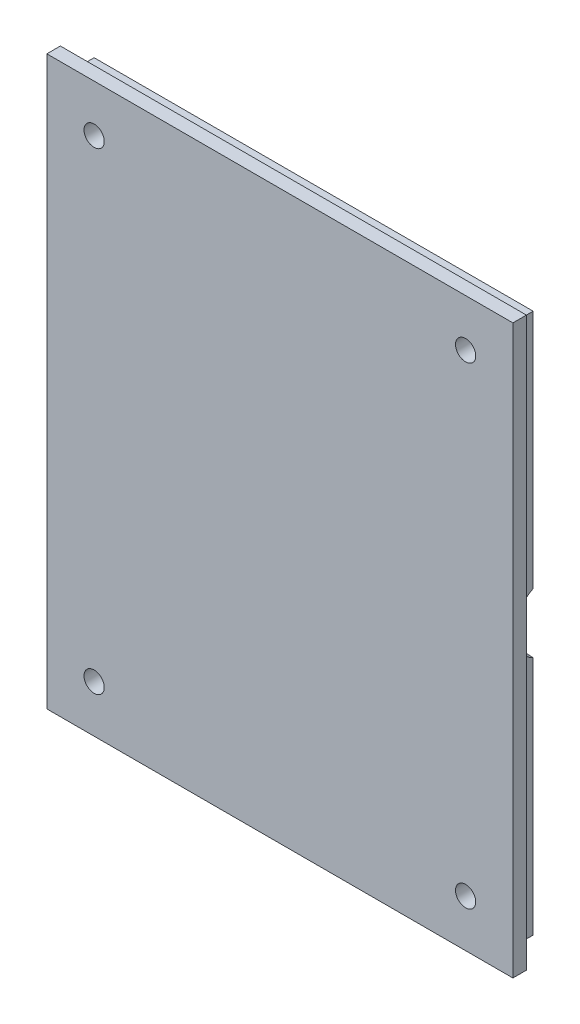
ISO-10303-21;
HEADER;
FILE_DESCRIPTION(('STEP AP214'),'2;1');
FILE_NAME('part.step','',(''),(''),'','','');
FILE_SCHEMA(('AUTOMOTIVE_DESIGN { 1 0 10303 214 1 1 1 1 }'));
ENDSEC;
DATA;
#1=APPLICATION_CONTEXT('core data for automotive mechanical design processes');
#2=APPLICATION_PROTOCOL_DEFINITION('international standard','automotive_design',2000,#1);
#3=PRODUCT_CONTEXT('',#1,'mechanical');
#4=PRODUCT('Part','Part','',(#3));
#5=PRODUCT_RELATED_PRODUCT_CATEGORY('part','',(#4));
#6=PRODUCT_DEFINITION_FORMATION('','',#4);
#7=PRODUCT_DEFINITION_CONTEXT('part definition',#1,'design');
#8=PRODUCT_DEFINITION('design','',#6,#7);
#9=PRODUCT_DEFINITION_SHAPE('','',#8);
#10=(LENGTH_UNIT() NAMED_UNIT(*) SI_UNIT(.MILLI.,.METRE.));
#11=(NAMED_UNIT(*) PLANE_ANGLE_UNIT() SI_UNIT($,.RADIAN.));
#12=(NAMED_UNIT(*) SI_UNIT($,.STERADIAN.) SOLID_ANGLE_UNIT());
#13=UNCERTAINTY_MEASURE_WITH_UNIT(LENGTH_MEASURE(1.E-05),#10,'distance_accuracy_value','');
#14=(GEOMETRIC_REPRESENTATION_CONTEXT(3) GLOBAL_UNCERTAINTY_ASSIGNED_CONTEXT((#13)) GLOBAL_UNIT_ASSIGNED_CONTEXT((#10,
#11,#12)) REPRESENTATION_CONTEXT('',''));
#15=CARTESIAN_POINT('',(0.,0.,0.));
#16=DIRECTION('',(0.,0.,1.));
#17=DIRECTION('',(1.,0.,0.));
#18=AXIS2_PLACEMENT_3D('',#15,#16,#17);
#19=CARTESIAN_POINT('',(-32.5,-40.,-5.));
#20=DIRECTION('',(0.,1.,0.));
#21=DIRECTION('',(0.,0.,-1.));
#22=AXIS2_PLACEMENT_3D('',#19,#20,#21);
#23=PLANE('',#22);
#24=DIRECTION('',(0.,0.,1.));
#25=VECTOR('',#24,1.);
#26=CARTESIAN_POINT('',(-32.5,-40.,-5.));
#27=LINE('',#26,#25);
#28=CARTESIAN_POINT('',(-32.5,-40.,-5.));
#29=VERTEX_POINT('',#28);
#30=CARTESIAN_POINT('',(-32.5,-40.,-2.));
#31=VERTEX_POINT('',#30);
#32=EDGE_CURVE('E137',#29,#31,#27,.T.);
#33=ORIENTED_EDGE('',*,*,#32,.F.);
#34=DIRECTION('',(1.,0.,0.));
#35=VECTOR('',#34,1.);
#36=CARTESIAN_POINT('',(-32.5,-40.,-5.));
#37=LINE('',#36,#35);
#38=CARTESIAN_POINT('',(32.5,-40.,-5.));
#39=VERTEX_POINT('',#38);
#40=EDGE_CURVE('E132',#29,#39,#37,.T.);
#41=ORIENTED_EDGE('',*,*,#40,.T.);
#42=DIRECTION('',(0.,0.,1.));
#43=VECTOR('',#42,1.);
#44=CARTESIAN_POINT('',(32.5,-40.,-5.));
#45=LINE('',#44,#43);
#46=CARTESIAN_POINT('',(32.5,-40.,-2.));
#47=VERTEX_POINT('',#46);
#48=EDGE_CURVE('E52',#39,#47,#45,.T.);
#49=ORIENTED_EDGE('',*,*,#48,.T.);
#50=DIRECTION('',(1.,0.,0.));
#51=VECTOR('',#50,1.);
#52=CARTESIAN_POINT('',(0.,-40.,-2.));
#53=LINE('',#52,#51);
#54=EDGE_CURVE('E147',#31,#47,#53,.T.);
#55=ORIENTED_EDGE('',*,*,#54,.F.);
#56=EDGE_LOOP('',(#33,#41,#49,#55));
#57=FACE_BOUND('',#56,.T.);
#58=ADVANCED_FACE('F39',(#57),#23,.F.);
#59=CARTESIAN_POINT('',(32.5,-40.,-5.));
#60=DIRECTION('',(-1.,0.,0.));
#61=DIRECTION('',(0.,-1.,0.));
#62=AXIS2_PLACEMENT_3D('',#59,#60,#61);
#63=PLANE('',#62);
#64=DIRECTION('',(0.,1.,0.));
#65=VECTOR('',#64,1.);
#66=CARTESIAN_POINT('',(32.5,-40.,-5.));
#67=LINE('',#66,#65);
#68=CARTESIAN_POINT('',(32.5,4.44136884406779,-5.));
#69=VERTEX_POINT('',#68);
#70=CARTESIAN_POINT('',(32.5,40.,-5.));
#71=VERTEX_POINT('',#70);
#72=EDGE_CURVE('E119',#69,#71,#67,.T.);
#73=ORIENTED_EDGE('',*,*,#72,.T.);
#74=DIRECTION('',(0.,0.,1.));
#75=VECTOR('',#74,1.);
#76=CARTESIAN_POINT('',(32.5,40.,-5.));
#77=LINE('',#76,#75);
#78=CARTESIAN_POINT('',(32.5,40.,-2.));
#79=VERTEX_POINT('',#78);
#80=EDGE_CURVE('E143',#71,#79,#77,.T.);
#81=ORIENTED_EDGE('',*,*,#80,.T.);
#82=DIRECTION('',(0.,1.,0.));
#83=VECTOR('',#82,1.);
#84=CARTESIAN_POINT('',(32.5,0.,-2.));
#85=LINE('',#84,#83);
#86=EDGE_CURVE('E64',#47,#79,#85,.T.);
#87=ORIENTED_EDGE('',*,*,#86,.F.);
#88=ORIENTED_EDGE('',*,*,#48,.F.);
#89=CARTESIAN_POINT('',(32.5,-4.44136884406779,-5.));
#90=VERTEX_POINT('',#89);
#91=EDGE_CURVE('E117',#39,#90,#67,.T.);
#92=ORIENTED_EDGE('',*,*,#91,.T.);
#93=CARTESIAN_POINT('',(32.4999979757134,-3.516874652611,-3.73385346071111));
#94=CARTESIAN_POINT('',(32.4999981249475,-3.6171821269882,-3.8337699571446));
#95=CARTESIAN_POINT('',(32.4999994974993,-3.7132428965186,-3.93792892344822));
#96=CARTESIAN_POINT('',(32.500000502642,-3.89625520266674,-4.15402293486602));
#97=CARTESIAN_POINT('',(32.5000001347436,-3.98320417056387,-4.26596015804758));
#98=CARTESIAN_POINT('',(32.4999998651276,-4.14742708099092,-4.496878385669));
#99=CARTESIAN_POINT('',(32.4999999638562,-4.22469169243426,-4.61586602325403));
#100=CARTESIAN_POINT('',(32.5000000361572,-4.36894436788852,-4.85997491381459));
#101=CARTESIAN_POINT('',(32.5000000096833,-4.43592862402899,-4.98509841699587));
#102=CARTESIAN_POINT('',(32.4999999903277,-4.55905714962186,-5.2403939297611));
#103=CARTESIAN_POINT('',(32.4999999974079,-4.61521363309605,-5.37056004963592));
#104=CARTESIAN_POINT('',(32.500000002593,-4.71642011367928,-5.63519528130909));
#105=CARTESIAN_POINT('',(32.5000000006946,-4.76146601359968,-5.76966595988538));
#106=CARTESIAN_POINT('',(32.4999999993058,-4.84009834812408,-6.04182569298067));
#107=CARTESIAN_POINT('',(32.4999999998139,-4.87369190753094,-6.17951268935695));
#108=CARTESIAN_POINT('',(32.5000000001861,-4.92924710919243,-6.45726628272309));
#109=CARTESIAN_POINT('',(32.50000000005,-4.95120443783057,-6.59733374233348));
#110=CARTESIAN_POINT('',(32.4999999999498,-4.98339622805315,-6.87942798304581));
#111=CARTESIAN_POINT('',(32.4999999999865,-4.99357919148764,-7.02146064224516));
#112=CARTESIAN_POINT('',(32.5000000000135,-5.00198786039795,-7.30593171991061));
#113=CARTESIAN_POINT('',(32.5000000000036,-5.00020914278654,-7.44837026900074));
#114=CARTESIAN_POINT('',(32.4999999999964,-4.98470443122162,-7.73255246145232));
#115=CARTESIAN_POINT('',(32.499999999999,-4.97098204326742,-7.87429630157017));
#116=CARTESIAN_POINT('',(32.500000000001,-4.93168606138697,-8.15618479384486));
#117=CARTESIAN_POINT('',(32.5000000000003,-4.90610808724715,-8.29632883530815));
#118=CARTESIAN_POINT('',(32.4999999999997,-4.84317666000906,-8.57441673210747));
#119=CARTESIAN_POINT('',(32.4999999999999,-4.80578607785502,-8.712352189179));
#120=CARTESIAN_POINT('',(32.5000000000001,-4.71950024667184,-8.98463022938432));
#121=CARTESIAN_POINT('',(32.5,-4.67060073645046,-9.11897146118568));
#122=CARTESIAN_POINT('',(32.5,-4.56165242832222,-9.38300852188289));
#123=CARTESIAN_POINT('',(32.5,-4.50160770485095,-9.51270602781528));
#124=CARTESIAN_POINT('',(32.5,-4.37078178578848,-9.7665841465862));
#125=CARTESIAN_POINT('',(32.5,-4.29999664458931,-9.89076271021739));
#126=CARTESIAN_POINT('',(32.5,-4.07248787128145,-10.253188966385));
#127=CARTESIAN_POINT('',(32.5,-3.90032848673595,-10.4820101269757));
#128=CARTESIAN_POINT('',(32.5,-3.51988267372951,-10.9071225556019));
#129=CARTESIAN_POINT('',(32.5,-3.31159748826072,-11.1034149424112));
#130=CARTESIAN_POINT('',(32.5,-2.86621412310481,-11.4565788559539));
#131=CARTESIAN_POINT('',(32.5,-2.62932384459324,-11.6137120850903));
#132=CARTESIAN_POINT('',(32.5,-2.13233243378857,-11.8855244579747));
#133=CARTESIAN_POINT('',(32.5,-1.87223257436095,-12.0002059280987));
#134=CARTESIAN_POINT('',(32.5,-1.33884081874991,-12.1827441174686));
#135=CARTESIAN_POINT('',(32.5,-1.06569701871864,-12.2510335918701));
#136=CARTESIAN_POINT('',(32.5,-0.511798107779041,-12.3404305262509));
#137=CARTESIAN_POINT('',(32.5,-0.231043356422543,-12.3615402111508));
#138=CARTESIAN_POINT('',(32.5,0.32805462763993,-12.3559522226046));
#139=CARTESIAN_POINT('',(32.5,0.606401190018648,-12.3295815517884));
#140=CARTESIAN_POINT('',(32.5,1.15470730130728,-12.2304735258888));
#141=CARTESIAN_POINT('',(32.5,1.42466692663318,-12.1577365933928));
#142=CARTESIAN_POINT('',(32.5,1.94856914976691,-11.9680959765911));
#143=CARTESIAN_POINT('',(32.5,2.20251278434363,-11.8511951545939));
#144=CARTESIAN_POINT('',(32.5,2.6873502364433,-11.5766935061829));
#145=CARTESIAN_POINT('',(32.5,2.91824335688695,-11.4190914494245));
#146=CARTESIAN_POINT('',(32.5,3.35212341307692,-11.0665820546904));
#147=CARTESIAN_POINT('',(32.5,3.55491266179812,-10.8714314478945));
#148=CARTESIAN_POINT('',(32.5,3.92522581281354,-10.4501361521947));
#149=CARTESIAN_POINT('',(32.5,4.09274796169792,-10.2239899231727));
#150=CARTESIAN_POINT('',(32.5,4.38942245907388,-9.74483683000219));
#151=CARTESIAN_POINT('',(32.5,4.51819931693697,-9.49159745149484));
#152=CARTESIAN_POINT('',(32.5,4.73175528083807,-8.96719995296679));
#153=CARTESIAN_POINT('',(32.5,4.81653251946085,-8.69604107296389));
#154=CARTESIAN_POINT('',(32.5,4.94022345439426,-8.14143825450735));
#155=CARTESIAN_POINT('',(32.5,4.97880888369239,-7.85792105509537));
#156=CARTESIAN_POINT('',(32.5,5.00793192631867,-7.28842510052362));
#157=CARTESIAN_POINT('',(32.5,4.99846869703963,-7.00244630228372));
#158=CARTESIAN_POINT('',(32.5,4.9316418364214,-6.43560769372061));
#159=CARTESIAN_POINT('',(32.5,4.87419098393685,-6.15475815672452));
#160=CARTESIAN_POINT('',(32.5,4.71278923679523,-5.60673943680414));
#161=CARTESIAN_POINT('',(32.5,4.60883893536106,-5.33957007940161));
#162=CARTESIAN_POINT('',(32.5,4.35773944290128,-4.82750553697763));
#163=CARTESIAN_POINT('',(32.5,4.21073425253095,-4.58253961071515));
#164=CARTESIAN_POINT('',(32.5,3.87731157798399,-4.12087478741439));
#165=CARTESIAN_POINT('',(32.5,3.69089525019269,-3.90417506130251));
#166=CARTESIAN_POINT('',(32.5,3.38661999914296,-3.60596720644367));
#167=CARTESIAN_POINT('',(32.5,3.28139333188492,-3.51125102837838));
#168=CARTESIAN_POINT('',(32.5,3.06331128068612,-3.33107519250852));
#169=CARTESIAN_POINT('',(32.5,2.95045881169792,-3.24561202989589));
#170=CARTESIAN_POINT('',(32.5,2.71787816466228,-3.08454401218533));
#171=CARTESIAN_POINT('',(32.5,2.59814759264898,-3.00894261984981));
#172=CARTESIAN_POINT('',(32.5,2.35274085480321,-2.86820864177198));
#173=CARTESIAN_POINT('',(32.5,2.22706695546945,-2.80307210624801));
#174=CARTESIAN_POINT('',(32.5,1.97142111582366,-2.68408587451887));
#175=CARTESIAN_POINT('',(32.5000000000001,1.84148016040701,-2.6301695895228));
#176=CARTESIAN_POINT('',(32.4999999999999,1.57755242962669,-2.53354016753895));
#177=CARTESIAN_POINT('',(32.4999999999998,1.44356720224795,-2.49082280319967));
#178=CARTESIAN_POINT('',(32.5000000000002,1.17242001820544,-2.41686905887265));
#179=CARTESIAN_POINT('',(32.5000000000008,1.03525708890694,-2.38563624479068));
#180=CARTESIAN_POINT('',(32.4999999999992,0.758829948227324,-2.33491116293828));
#181=CARTESIAN_POINT('',(32.4999999999969,0.619566541668243,-2.31541450986564));
#182=CARTESIAN_POINT('',(32.5000000000031,0.3404823034997,-2.28834569232074));
#183=CARTESIAN_POINT('',(32.5000000000115,0.200666340952009,-2.28072330527807));
#184=CARTESIAN_POINT('',(32.4999999999885,-0.0790581208254349,-2.27730165717199));
#185=CARTESIAN_POINT('',(32.4999999999571,-0.218966566102274,-2.28149798808714));
#186=CARTESIAN_POINT('',(32.5000000000429,-0.498016288028657,-2.30167964903476));
#187=CARTESIAN_POINT('',(32.5000000001601,-0.63715704529949,-2.31767216057601));
#188=CARTESIAN_POINT('',(32.4999999998399,-0.913542688765869,-2.36132855833972));
#189=CARTESIAN_POINT('',(32.4999999994027,-1.05078825315074,-2.38898815155321));
#190=CARTESIAN_POINT('',(32.5000000005971,-1.3224135120005,-2.45576358729008));
#191=CARTESIAN_POINT('',(32.5000000022279,-1.45679417316671,-2.49487549766725));
#192=CARTESIAN_POINT('',(32.4999999977729,-1.72173714527039,-2.58425587710943));
#193=CARTESIAN_POINT('',(32.4999999916899,-1.85230082810006,-2.63452028055319));
#194=CARTESIAN_POINT('',(32.5000000083026,-2.10862623722175,-2.74579851580137));
#195=CARTESIAN_POINT('',(32.5000000309725,-2.23439217849113,-2.80680263484359));
#196=CARTESIAN_POINT('',(32.4999999690357,-2.48032355243891,-2.93912397088406));
#197=CARTESIAN_POINT('',(32.4999998844575,-2.60049046278283,-3.01043844621033));
#198=CARTESIAN_POINT('',(32.500000142093,-2.86133182907438,-3.18041916331689));
#199=CARTESIAN_POINT('',(32.5000005868452,-3.00037348724913,-3.28160491760796));
#200=CARTESIAN_POINT('',(32.499999413156,-3.26731718847826,-3.49773147407023));
#201=CARTESIAN_POINT('',(32.4999977947187,-3.39521925338495,-3.61267224925745));
#202=CARTESIAN_POINT('',(32.4999979757134,-3.516874652611,-3.73385346071111));
#203=B_SPLINE_CURVE_WITH_KNOTS('',3,(#93,#94,#95,#96,#97,#98,#99,#100,#101,#102,#103,#104,#105,
#106,#107,#108,#109,#110,#111,#112,#113,#114,#115,#116,#117,#118,#119,#120,#121,#122,#123,#124,
#125,#126,#127,#128,#129,#130,#131,#132,#133,#134,#135,#136,#137,#138,#139,#140,#141,#142,#143,
#144,#145,#146,#147,#148,#149,#150,#151,#152,#153,#154,#155,#156,#157,#158,#159,#160,#161,#162,
#163,#164,#165,#166,#167,#168,#169,#170,#171,#172,#173,#174,#175,#176,#177,#178,#179,#180,#181,
#182,#183,#184,#185,#186,#187,#188,#189,#190,#191,#192,#193,#194,#195,#196,#197,#198,#199,#200,
#201,#202),.UNSPECIFIED.,.T.,.F.,(4,2,2,2,2,2,2,2,2,2,2,2,2,2,2,2,2,2,2,2,2,2,2,2,2,2,2,2,2,2,2,
2,2,2,2,2,2,2,2,2,2,2,2,2,2,2,2,2,2,2,2,2,2,2,4),(0.,0.424588292912044,0.849295961909985,
1.2744097505481,1.69968062437603,2.12446893800834,2.54941366506714,2.97409353829083,
3.39893073281214,3.82561911387645,4.25246528076314,4.67918262014399,5.10605774208933,
5.53428818343303,5.96267742765055,6.39091036988927,6.81930101069769,7.67389342975139,
8.52845645039716,9.37714523754839,10.2257875092746,11.0664005600881,11.9069739681497,
12.7417803781225,13.5765791796829,14.4113238863292,15.2460938291635,16.0864661760144,
16.9268802946391,17.7751945538913,18.6235448140334,19.4778888399408,20.3322478481377,
21.1881631062646,22.0440674452502,22.8971412091028,23.7501899458898,24.1745022531405,
24.5986532751756,25.0229528307041,25.4470918634611,25.8686370663418,26.2900229151164,
26.7115394922082,27.1328984686283,27.5524704085024,27.9718858815609,28.3915569055169,
28.8110736422194,29.2304465066684,29.6496667399522,30.0685097692938,30.4872416264072,
31.0021938762929,31.5171451159851),.UNSPECIFIED.);
#204=EDGE_CURVE('E120',#69,#90,#203,.T.);
#205=ORIENTED_EDGE('',*,*,#204,.F.);
#206=EDGE_LOOP('',(#73,#81,#87,#88,#92,#205));
#207=FACE_BOUND('',#206,.T.);
#208=ADVANCED_FACE('F125',(#207),#63,.F.);
#209=CARTESIAN_POINT('',(-32.5,40.,-5.));
#210=DIRECTION('',(0.,1.,0.));
#211=DIRECTION('',(-1.,0.,0.));
#212=AXIS2_PLACEMENT_3D('',#209,#210,#211);
#213=PLANE('',#212);
#214=DIRECTION('',(1.,0.,0.));
#215=VECTOR('',#214,1.);
#216=CARTESIAN_POINT('',(0.,40.,-2.));
#217=LINE('',#216,#215);
#218=CARTESIAN_POINT('',(-32.5,40.,-2.));
#219=VERTEX_POINT('',#218);
#220=EDGE_CURVE('E186',#219,#79,#217,.T.);
#221=ORIENTED_EDGE('',*,*,#220,.T.);
#222=ORIENTED_EDGE('',*,*,#80,.F.);
#223=DIRECTION('',(1.,0.,0.));
#224=VECTOR('',#223,1.);
#225=CARTESIAN_POINT('',(-32.5,40.,-5.));
#226=LINE('',#225,#224);
#227=CARTESIAN_POINT('',(-32.5,40.,-5.));
#228=VERTEX_POINT('',#227);
#229=EDGE_CURVE('E128',#228,#71,#226,.T.);
#230=ORIENTED_EDGE('',*,*,#229,.F.);
#231=DIRECTION('',(0.,0.,1.));
#232=VECTOR('',#231,1.);
#233=CARTESIAN_POINT('',(-32.5,40.,-5.));
#234=LINE('',#233,#232);
#235=EDGE_CURVE('E140',#228,#219,#234,.T.);
#236=ORIENTED_EDGE('',*,*,#235,.T.);
#237=EDGE_LOOP('',(#221,#222,#230,#236));
#238=FACE_BOUND('',#237,.T.);
#239=ADVANCED_FACE('F201',(#238),#213,.T.);
#240=CARTESIAN_POINT('',(-32.5,-40.,-5.));
#241=DIRECTION('',(-1.,0.,0.));
#242=DIRECTION('',(0.,0.,-1.));
#243=AXIS2_PLACEMENT_3D('',#240,#241,#242);
#244=PLANE('',#243);
#245=DIRECTION('',(0.,1.,0.));
#246=VECTOR('',#245,1.);
#247=CARTESIAN_POINT('',(-32.5,0.,-2.));
#248=LINE('',#247,#246);
#249=EDGE_CURVE('E188',#31,#219,#248,.T.);
#250=ORIENTED_EDGE('',*,*,#249,.T.);
#251=ORIENTED_EDGE('',*,*,#235,.F.);
#252=DIRECTION('',(0.,1.,0.));
#253=VECTOR('',#252,1.);
#254=CARTESIAN_POINT('',(-32.5,-40.,-5.));
#255=LINE('',#254,#253);
#256=EDGE_CURVE('E130',#29,#228,#255,.T.);
#257=ORIENTED_EDGE('',*,*,#256,.F.);
#258=ORIENTED_EDGE('',*,*,#32,.T.);
#259=EDGE_LOOP('',(#250,#251,#257,#258));
#260=FACE_BOUND('',#259,.T.);
#261=ADVANCED_FACE('F204',(#260),#244,.T.);
#262=CARTESIAN_POINT('',(0.,0.,-5.));
#263=DIRECTION('',(0.,0.,-1.));
#264=DIRECTION('',(1.,0.,0.));
#265=AXIS2_PLACEMENT_3D('',#262,#263,#264);
#266=PLANE('',#265);
#267=CARTESIAN_POINT('',(27.5,-35.,-5.));
#268=DIRECTION('',(0.,0.,1.));
#269=DIRECTION('',(1.,0.,0.));
#270=AXIS2_PLACEMENT_3D('',#267,#268,#269);
#271=CIRCLE('',#270,1.5);
#272=CARTESIAN_POINT('',(29.,-35.,-5.));
#273=VERTEX_POINT('',#272);
#274=EDGE_CURVE('E123',#273,#273,#271,.T.);
#275=ORIENTED_EDGE('',*,*,#274,.T.);
#276=EDGE_LOOP('',(#275));
#277=FACE_BOUND('',#276,.T.);
#278=CARTESIAN_POINT('',(-27.5,-35.,-5.));
#279=DIRECTION('',(0.,0.,1.));
#280=DIRECTION('',(1.,0.,0.));
#281=AXIS2_PLACEMENT_3D('',#278,#279,#280);
#282=CIRCLE('',#281,1.5);
#283=CARTESIAN_POINT('',(-26.,-35.,-5.));
#284=VERTEX_POINT('',#283);
#285=EDGE_CURVE('E403',#284,#284,#282,.T.);
#286=ORIENTED_EDGE('',*,*,#285,.T.);
#287=EDGE_LOOP('',(#286));
#288=FACE_BOUND('',#287,.T.);
#289=CARTESIAN_POINT('',(-27.5,35.,-5.));
#290=DIRECTION('',(0.,0.,1.));
#291=DIRECTION('',(1.,0.,0.));
#292=AXIS2_PLACEMENT_3D('',#289,#290,#291);
#293=CIRCLE('',#292,1.5);
#294=CARTESIAN_POINT('',(-26.,35.,-5.));
#295=VERTEX_POINT('',#294);
#296=EDGE_CURVE('E401',#295,#295,#293,.T.);
#297=ORIENTED_EDGE('',*,*,#296,.T.);
#298=EDGE_LOOP('',(#297));
#299=FACE_BOUND('',#298,.T.);
#300=CARTESIAN_POINT('',(27.5,35.,-5.));
#301=DIRECTION('',(0.,0.,1.));
#302=DIRECTION('',(1.,0.,0.));
#303=AXIS2_PLACEMENT_3D('',#300,#301,#302);
#304=CIRCLE('',#303,1.5);
#305=CARTESIAN_POINT('',(29.,35.,-5.));
#306=VERTEX_POINT('',#305);
#307=EDGE_CURVE('E398',#306,#306,#304,.T.);
#308=ORIENTED_EDGE('',*,*,#307,.T.);
#309=EDGE_LOOP('',(#308));
#310=FACE_BOUND('',#309,.T.);
#311=CARTESIAN_POINT('',(52.6558443707464,1.83561105481302,-5.));
#312=CARTESIAN_POINT('',(52.5737148612363,1.90619296503915,-5.));
#313=CARTESIAN_POINT('',(52.4891116073405,1.97378906228447,-5.));
#314=CARTESIAN_POINT('',(52.3159303022378,2.10350042620041,-5.));
#315=CARTESIAN_POINT('',(52.2273565479426,2.16562141190841,-5.));
#316=CARTESIAN_POINT('',(52.0474172021252,2.28476354522464,-5.));
#317=CARTESIAN_POINT('',(51.9560652514872,2.34180547127826,-5.));
#318=CARTESIAN_POINT('',(51.7707827815188,2.45157779134348,-5.));
#319=CARTESIAN_POINT('',(51.6768514957516,2.50430688488839,-5.));
#320=CARTESIAN_POINT('',(51.3953402149125,2.65484632624566,-5.));
#321=CARTESIAN_POINT('',(51.2047832522632,2.7471073258244,-5.));
#322=CARTESIAN_POINT('',(50.8179959101407,2.9193427950116,-5.));
#323=CARTESIAN_POINT('',(50.6217582303496,2.99930053761165,-5.));
#324=CARTESIAN_POINT('',(50.1518571050608,3.17658771600231,-5.));
#325=CARTESIAN_POINT('',(49.8764789296329,3.26935666098378,-5.));
#326=CARTESIAN_POINT('',(49.3209180508561,3.43933880428353,-5.));
#327=CARTESIAN_POINT('',(49.0407330852568,3.51654444717197,-5.));
#328=CARTESIAN_POINT('',(48.4769069359302,3.65828179285345,-5.));
#329=CARTESIAN_POINT('',(48.1932625357492,3.72280056518377,-5.));
#330=CARTESIAN_POINT('',(47.6237666549316,3.84126017765177,-5.));
#331=CARTESIAN_POINT('',(47.3379149194201,3.89519977666908,-5.));
#332=CARTESIAN_POINT('',(46.7589300547261,3.99519609655886,-5.));
#333=CARTESIAN_POINT('',(46.4657660945496,4.04107248862638,-5.));
#334=CARTESIAN_POINT('',(45.878324987866,4.12503185631241,-5.));
#335=CARTESIAN_POINT('',(45.5840477982942,4.16311452722889,-5.));
#336=CARTESIAN_POINT('',(44.9950288541893,4.23261207999385,-5.));
#337=CARTESIAN_POINT('',(44.7002879140713,4.26403393430138,-5.));
#338=CARTESIAN_POINT('',(44.1102668996281,4.32120480744591,-5.));
#339=CARTESIAN_POINT('',(43.8149868336445,4.34695391331725,-5.));
#340=CARTESIAN_POINT('',(43.1729697092692,4.39758351356227,-5.));
#341=CARTESIAN_POINT('',(42.826160616668,4.42154452292055,-5.));
#342=CARTESIAN_POINT('',(42.1321889564023,4.46373215143646,-5.));
#343=CARTESIAN_POINT('',(41.7850263781238,4.48195859298635,-5.));
#344=CARTESIAN_POINT('',(41.090430489041,4.51344543398709,-5.));
#345=CARTESIAN_POINT('',(40.7429971472443,4.52670514086123,-5.));
#346=CARTESIAN_POINT('',(40.0479871197414,4.54882306881996,-5.));
#347=CARTESIAN_POINT('',(39.7004104319108,4.55768122213753,-5.));
#348=CARTESIAN_POINT('',(39.0044331964172,4.5713951953669,-5.));
#349=CARTESIAN_POINT('',(38.6560324811339,4.57624238739797,-5.));
#350=CARTESIAN_POINT('',(37.9591952711582,4.58211631585003,-5.));
#351=CARTESIAN_POINT('',(37.6107587760967,4.58314300781433,-5.));
#352=CARTESIAN_POINT('',(36.9139450811492,4.58142140242078,-5.));
#353=CARTESIAN_POINT('',(36.5655678799411,4.57867364782529,-5.));
#354=CARTESIAN_POINT('',(35.8688694847532,4.56928267464571,-5.));
#355=CARTESIAN_POINT('',(35.5205482901361,4.56263950406399,-5.));
#356=CARTESIAN_POINT('',(34.8279238217026,4.54526411709231,-5.));
#357=CARTESIAN_POINT('',(34.4836193897259,4.53457869775268,-5.));
#358=CARTESIAN_POINT('',(33.7951851538115,4.50866146380066,-5.));
#359=CARTESIAN_POINT('',(33.4510553469921,4.49342972682479,-5.));
#360=CARTESIAN_POINT('',(32.7629164227228,4.45777671361025,-5.));
#361=CARTESIAN_POINT('',(32.4189074162545,4.43735326566391,-5.));
#362=CARTESIAN_POINT('',(31.7312997590968,4.39047984740062,-5.));
#363=CARTESIAN_POINT('',(31.3877011022206,4.36402996912503,-5.));
#364=CARTESIAN_POINT('',(30.7022263244072,4.30412344551377,-5.));
#365=CARTESIAN_POINT('',(30.3603482256508,4.27068972587798,-5.));
#366=CARTESIAN_POINT('',(29.6774806650399,4.19541261316078,-5.));
#367=CARTESIAN_POINT('',(29.3364912673504,4.15356862900796,-5.));
#368=CARTESIAN_POINT('',(28.6561543154048,4.0598001247536,-5.));
#369=CARTESIAN_POINT('',(28.3168056993335,4.00788338937031,-5.));
#370=CARTESIAN_POINT('',(27.6402355360287,3.89178621941212,-5.));
#371=CARTESIAN_POINT('',(27.3030135556711,3.82760837120215,-5.));
#372=CARTESIAN_POINT('',(26.8221579439824,3.72481650022733,-5.));
#373=CARTESIAN_POINT('',(26.6772031772214,3.69234783683178,-5.));
#374=CARTESIAN_POINT('',(26.388028236343,3.62427838705663,-5.));
#375=CARTESIAN_POINT('',(26.2438080747042,3.58867754765763,-5.));
#376=CARTESIAN_POINT('',(25.8122992676925,3.47666107571903,-5.));
#377=CARTESIAN_POINT('',(25.5263282938654,3.39506619396757,-5.));
#378=CARTESIAN_POINT('',(24.9597842248459,3.21489917554103,-5.));
#379=CARTESIAN_POINT('',(24.6792089347544,3.11633411179338,-5.));
#380=CARTESIAN_POINT('',(24.2648193681647,2.95243362168725,-5.));
#381=CARTESIAN_POINT('',(24.1278146609834,2.89514722151166,-5.));
#382=CARTESIAN_POINT('',(23.8565308533153,2.77447390868267,-5.));
#383=CARTESIAN_POINT('',(23.7222512103275,2.71108822498058,-5.));
#384=CARTESIAN_POINT('',(23.456071667506,2.57678195658306,-5.));
#385=CARTESIAN_POINT('',(23.32420127231,2.50580249537055,-5.));
#386=CARTESIAN_POINT('',(23.0652126671185,2.35570549624436,-5.));
#387=CARTESIAN_POINT('',(22.9380923309359,2.27659166034485,-5.));
#388=CARTESIAN_POINT('',(22.6906855037313,2.10924876213195,-5.));
#389=CARTESIAN_POINT('',(22.5703734169688,2.02105792046874,-5.));
#390=CARTESIAN_POINT('',(22.3385297995492,1.83390729850666,-5.));
#391=CARTESIAN_POINT('',(22.2269881162762,1.7349602954948,-5.));
#392=CARTESIAN_POINT('',(22.0279891749625,1.53651336908171,-5.));
#393=CARTESIAN_POINT('',(21.9392342474893,1.43833081565375,-5.));
#394=CARTESIAN_POINT('',(21.7748772741063,1.23124088612605,-5.));
#395=CARTESIAN_POINT('',(21.6992817096507,1.12232826620906,-5.));
#396=CARTESIAN_POINT('',(21.5652746394898,0.892212368759751,-5.));
#397=CARTESIAN_POINT('',(21.5071020503863,0.770866364450886,-5.));
#398=CARTESIAN_POINT('',(21.4154072792764,0.51921259051274,-5.));
#399=CARTESIAN_POINT('',(21.3818248216192,0.388927596332765,-5.));
#400=CARTESIAN_POINT('',(21.3460799533482,0.139424314834985,-5.));
#401=CARTESIAN_POINT('',(21.3407348424352,0.0206672117130276,-5.));
#402=CARTESIAN_POINT('',(21.3535683071778,-0.215580900129967,-5.));
#403=CARTESIAN_POINT('',(21.3717518703016,-0.33307163509003,-5.));
#404=CARTESIAN_POINT('',(21.4254601588697,-0.546982950388944,-5.));
#405=CARTESIAN_POINT('',(21.4583049360462,-0.644103132011713,-5.));
#406=CARTESIAN_POINT('',(21.5373737796055,-0.832651922006893,-5.));
#407=CARTESIAN_POINT('',(21.5836003032623,-0.924079481299898,-5.));
#408=CARTESIAN_POINT('',(21.7205236188376,-1.15811902450344,-5.));
#409=CARTESIAN_POINT('',(21.8205654139608,-1.29524335257105,-5.));
#410=CARTESIAN_POINT('',(22.0404607449028,-1.55261286962179,-5.));
#411=CARTESIAN_POINT('',(22.160377018299,-1.67280230358174,-5.));
#412=CARTESIAN_POINT('',(22.401183357186,-1.88729783549875,-5.));
#413=CARTESIAN_POINT('',(22.5208683520198,-1.98298181132209,-5.));
#414=CARTESIAN_POINT('',(22.7680095557932,-2.16383004943475,-5.));
#415=CARTESIAN_POINT('',(22.8954724615305,-2.24898504980064,-5.));
#416=CARTESIAN_POINT('',(23.1562195963462,-2.41032483490917,-5.));
#417=CARTESIAN_POINT('',(23.2895139774792,-2.48649304737719,-5.));
#418=CARTESIAN_POINT('',(23.5602297766749,-2.63090581657626,-5.));
#419=CARTESIAN_POINT('',(23.6976497173377,-2.69915316822324,-5.));
#420=CARTESIAN_POINT('',(24.0401758543347,-2.85889717148576,-5.));
#421=CARTESIAN_POINT('',(24.2471004478099,-2.94648673527348,-5.));
#422=CARTESIAN_POINT('',(24.665690305258,-3.10961124926073,-5.));
#423=CARTESIAN_POINT('',(24.8773578826804,-3.18514016406043,-5.));
#424=CARTESIAN_POINT('',(25.304383785287,-3.32617965037364,-5.));
#425=CARTESIAN_POINT('',(25.5197478523274,-3.39167269758263,-5.));
#426=CARTESIAN_POINT('',(25.9529182131677,-3.51403190608236,-5.));
#427=CARTESIAN_POINT('',(26.1707247979968,-3.57089702735986,-5.));
#428=CARTESIAN_POINT('',(26.6092829681986,-3.67750429894145,-5.));
#429=CARTESIAN_POINT('',(26.8300440395059,-3.7272071532312,-5.));
#430=CARTESIAN_POINT('',(27.2729201795097,-3.82013813082315,-5.));
#431=CARTESIAN_POINT('',(27.4950352943646,-3.86336603209973,-5.));
#432=CARTESIAN_POINT('',(28.1624100180418,-3.98453783880043,-5.));
#433=CARTESIAN_POINT('',(28.6091977687932,-4.05408661528502,-5.));
#434=CARTESIAN_POINT('',(29.5323776586464,-4.17964903591883,-5.));
#435=CARTESIAN_POINT('',(30.0089120848938,-4.23457728872962,-5.));
#436=CARTESIAN_POINT('',(30.9635169459503,-4.32937259711096,-5.));
#437=CARTESIAN_POINT('',(31.441587603384,-4.36923736036255,-5.));
#438=CARTESIAN_POINT('',(32.3989605099113,-4.43707241986672,-5.));
#439=CARTESIAN_POINT('',(32.8782634638526,-4.46503247897432,-5.));
#440=CARTESIAN_POINT('',(33.8372973443655,-4.51124942953174,-5.));
#441=CARTESIAN_POINT('',(34.3170282447561,-4.52950687857486,-5.));
#442=CARTESIAN_POINT('',(35.2750660126163,-4.55776767436692,-5.));
#443=CARTESIAN_POINT('',(35.7533720678397,-4.56779934566786,-5.));
#444=CARTESIAN_POINT('',(36.7100877579494,-4.580545919479,-5.));
#445=CARTESIAN_POINT('',(37.188497394565,-4.58326068859193,-5.));
#446=CARTESIAN_POINT('',(38.145079523474,-4.58160160402092,-5.));
#447=CARTESIAN_POINT('',(38.6232520213753,-4.57723108701774,-5.));
#448=CARTESIAN_POINT('',(39.5794624311221,-4.56104039206397,-5.));
#449=CARTESIAN_POINT('',(40.0575003459669,-4.54922039589976,-5.));
#450=CARTESIAN_POINT('',(41.0730722940917,-4.51515806446126,-5.));
#451=CARTESIAN_POINT('',(41.6105699145298,-4.49179711625188,-5.));
#452=CARTESIAN_POINT('',(42.6849617659889,-4.43204627332908,-5.));
#453=CARTESIAN_POINT('',(43.2218558905712,-4.39565435969123,-5.));
#454=CARTESIAN_POINT('',(44.0268917776505,-4.32846134490919,-5.));
#455=CARTESIAN_POINT('',(44.2955583829274,-4.30392001362778,-5.));
#456=CARTESIAN_POINT('',(44.8324030800475,-4.2500038317657,-5.));
#457=CARTESIAN_POINT('',(45.1005811864939,-4.22062912815266,-5.));
#458=CARTESIAN_POINT('',(45.6362263307486,-4.15632446753776,-5.));
#459=CARTESIAN_POINT('',(45.9036934910382,-4.12139554028242,-5.));
#460=CARTESIAN_POINT('',(46.4376993415982,-4.04509439724057,-5.));
#461=CARTESIAN_POINT('',(46.7042380756562,-4.00372248965016,-5.));
#462=CARTESIAN_POINT('',(47.2873711517752,-3.9047591560628,-5.));
#463=CARTESIAN_POINT('',(47.6037006215005,-3.8455784380697,-5.));
#464=CARTESIAN_POINT('',(48.2336165730722,-3.7142574745665,-5.));
#465=CARTESIAN_POINT('',(48.547203611098,-3.64211992383554,-5.));
#466=CARTESIAN_POINT('',(49.1681843707895,-3.48243246884023,-5.));
#467=CARTESIAN_POINT('',(49.4756061226927,-3.39499437715761,-5.));
#468=CARTESIAN_POINT('',(49.93200263801,-3.24900872371518,-5.));
#469=CARTESIAN_POINT('',(50.0833550143029,-3.19787166399874,-5.));
#470=CARTESIAN_POINT('',(50.3840429033833,-3.08998761700007,-5.));
#471=CARTESIAN_POINT('',(50.5333786156735,-3.03324118932566,-5.));
#472=CARTESIAN_POINT('',(50.8571687058244,-2.90215941383972,-5.));
#473=CARTESIAN_POINT('',(51.0310992088874,-2.82651917905032,-5.));
#474=CARTESIAN_POINT('',(51.3738471206366,-2.66472617154468,-5.));
#475=CARTESIAN_POINT('',(51.5426699708928,-2.57858511651769,-5.));
#476=CARTESIAN_POINT('',(51.791575595389,-2.43940264679674,-5.));
#477=CARTESIAN_POINT('',(51.8742838155619,-2.39104038806102,-5.));
#478=CARTESIAN_POINT('',(52.0375119615122,-2.29077876348358,-5.));
#479=CARTESIAN_POINT('',(52.1180323847861,-2.23888021135783,-5.));
#480=CARTESIAN_POINT('',(52.2767173299063,-2.13100644984327,-5.));
#481=CARTESIAN_POINT('',(52.3548728198107,-2.07501786313091,-5.));
#482=CARTESIAN_POINT('',(52.5079581300718,-1.95867872902109,-5.));
#483=CARTESIAN_POINT('',(52.5828852917872,-1.89832469208683,-5.));
#484=CARTESIAN_POINT('',(52.6558443707464,-1.83561105481302,-5.));
#485=B_SPLINE_CURVE_WITH_KNOTS('',3,(#311,#312,#313,#314,#315,#316,#317,#318,#319,#320,#321,
#322,#323,#324,#325,#326,#327,#328,#329,#330,#331,#332,#333,#334,#335,#336,#337,#338,#339,#340,
#341,#342,#343,#344,#345,#346,#347,#348,#349,#350,#351,#352,#353,#354,#355,#356,#357,#358,#359,
#360,#361,#362,#363,#364,#365,#366,#367,#368,#369,#370,#371,#372,#373,#374,#375,#376,#377,#378,
#379,#380,#381,#382,#383,#384,#385,#386,#387,#388,#389,#390,#391,#392,#393,#394,#395,#396,#397,
#398,#399,#400,#401,#402,#403,#404,#405,#406,#407,#408,#409,#410,#411,#412,#413,#414,#415,#416,
#417,#418,#419,#420,#421,#422,#423,#424,#425,#426,#427,#428,#429,#430,#431,#432,#433,#434,#435,
#436,#437,#438,#439,#440,#441,#442,#443,#444,#445,#446,#447,#448,#449,#450,#451,#452,#453,#454,
#455,#456,#457,#458,#459,#460,#461,#462,#463,#464,#465,#466,#467,#468,#469,#470,#471,#472,#473,
#474,#475,#476,#477,#478,#479,#480,#481,#482,#483,#484),.UNSPECIFIED.,.F.,.F.,(4,2,2,2,2,2,2,2,
2,2,2,2,2,2,2,2,2,2,2,2,2,2,2,2,2,2,2,2,2,2,2,2,2,2,2,2,2,2,2,2,2,2,2,2,2,2,2,2,2,2,2,2,2,2,2,2,
2,2,2,2,2,2,2,2,2,2,2,2,2,2,2,2,2,2,2,2,2,2,2,2,2,2,2,2,2,2,4),(0.,0.324703815691992,
0.649064339086194,0.972030271468481,1.29509323284849,1.92962737809599,2.56501672949322,
3.43613439951961,4.30767395312059,5.1800972277856,6.05262279167719,6.94269400261895,
7.83280000499169,8.72196960352851,9.61112555900053,10.6539754274517,11.6968575912701,
12.739885123683,13.7829287142171,14.8282101802858,15.873503809579,16.918647142232,
17.9637775960836,18.9971615497257,20.0305278574965,21.0643271387285,22.0981106318555,
23.1285524271722,24.1590666670342,25.1887876246254,26.218291611739,26.6639016752041,
27.109519283111,28.0012627547544,28.8926354563123,29.3380139225256,29.7833028361095,
30.2323360201686,30.6811657429361,31.1281774146433,31.5746637651415,31.9708642996019,
32.3672594281408,32.7688645485822,33.1694819233936,33.5237994903715,33.8781921757804,
34.1846224922266,34.4911091138337,34.9973965373573,35.5053137057275,35.964334741297,
36.4237567294459,36.8840131038784,37.3441065775633,38.0176992756674,38.6916280043138,
39.3667204346919,40.0418941764111,40.7206417005264,41.3994124935164,42.755419306417,
44.1942014758565,45.6332025069776,47.073438483096,48.513591682231,49.9487647989065,
51.3839640805998,52.8184876787972,54.2529762722966,55.8668735355358,57.4810209527236,
58.2903414326641,59.0996373082627,59.9087833159222,60.7178906304496,61.6831143451294,
62.6481375432761,63.6063825835248,64.0855665824289,64.5647028246161,65.1334210894259,
65.7015104425509,65.9888669056321,66.2761574686315,66.5644338220619,66.8529432124883),.UNSPECIFIED.);
#486=EDGE_CURVE('E11',#69,#90,#485,.T.);
#487=ORIENTED_EDGE('',*,*,#486,.T.);
#488=ORIENTED_EDGE('',*,*,#91,.F.);
#489=ORIENTED_EDGE('',*,*,#40,.F.);
#490=ORIENTED_EDGE('',*,*,#256,.T.);
#491=ORIENTED_EDGE('',*,*,#229,.T.);
#492=ORIENTED_EDGE('',*,*,#72,.F.);
#493=EDGE_LOOP('',(#487,#488,#489,#490,#491,#492));
#494=FACE_BOUND('',#493,.T.);
#495=ADVANCED_FACE('F114',(#277,#288,#299,#310,#494),#266,.T.);
#496=CARTESIAN_POINT('',(-34.5,0.,-2.));
#497=DIRECTION('',(-1.,0.,0.));
#498=DIRECTION('',(0.,0.,-1.));
#499=AXIS2_PLACEMENT_3D('',#496,#497,#498);
#500=PLANE('',#499);
#501=DIRECTION('',(0.,1.,0.));
#502=VECTOR('',#501,1.);
#503=CARTESIAN_POINT('',(-34.5,0.,0.));
#504=LINE('',#503,#502);
#505=CARTESIAN_POINT('',(-34.5,-42.,0.));
#506=VERTEX_POINT('',#505);
#507=CARTESIAN_POINT('',(-34.5,42.,0.));
#508=VERTEX_POINT('',#507);
#509=EDGE_CURVE('E122',#506,#508,#504,.T.);
#510=ORIENTED_EDGE('',*,*,#509,.T.);
#511=DIRECTION('',(0.,0.,1.));
#512=VECTOR('',#511,1.);
#513=CARTESIAN_POINT('',(-34.5,42.,-2.));
#514=LINE('',#513,#512);
#515=CARTESIAN_POINT('',(-34.5,42.,-2.));
#516=VERTEX_POINT('',#515);
#517=EDGE_CURVE('E162',#516,#508,#514,.T.);
#518=ORIENTED_EDGE('',*,*,#517,.F.);
#519=DIRECTION('',(0.,1.,0.));
#520=VECTOR('',#519,1.);
#521=CARTESIAN_POINT('',(-34.5,0.,-2.));
#522=LINE('',#521,#520);
#523=CARTESIAN_POINT('',(-34.5,-42.,-2.));
#524=VERTEX_POINT('',#523);
#525=EDGE_CURVE('E182',#524,#516,#522,.T.);
#526=ORIENTED_EDGE('',*,*,#525,.F.);
#527=DIRECTION('',(0.,0.,1.));
#528=VECTOR('',#527,1.);
#529=CARTESIAN_POINT('',(-34.5,-42.,-2.));
#530=LINE('',#529,#528);
#531=EDGE_CURVE('E148',#524,#506,#530,.T.);
#532=ORIENTED_EDGE('',*,*,#531,.T.);
#533=EDGE_LOOP('',(#510,#518,#526,#532));
#534=FACE_BOUND('',#533,.T.);
#535=ADVANCED_FACE('F216',(#534),#500,.T.);
#536=CARTESIAN_POINT('',(0.,-42.,-2.));
#537=DIRECTION('',(0.,1.,0.));
#538=DIRECTION('',(0.,0.,-1.));
#539=AXIS2_PLACEMENT_3D('',#536,#537,#538);
#540=PLANE('',#539);
#541=DIRECTION('',(1.,0.,0.));
#542=VECTOR('',#541,1.);
#543=CARTESIAN_POINT('',(0.,-42.,0.));
#544=LINE('',#543,#542);
#545=CARTESIAN_POINT('',(34.5,-42.,0.));
#546=VERTEX_POINT('',#545);
#547=EDGE_CURVE('E171',#506,#546,#544,.T.);
#548=ORIENTED_EDGE('',*,*,#547,.F.);
#549=ORIENTED_EDGE('',*,*,#531,.F.);
#550=DIRECTION('',(1.,0.,0.));
#551=VECTOR('',#550,1.);
#552=CARTESIAN_POINT('',(0.,-42.,-2.));
#553=LINE('',#552,#551);
#554=CARTESIAN_POINT('',(34.5,-42.,-2.));
#555=VERTEX_POINT('',#554);
#556=EDGE_CURVE('E179',#524,#555,#553,.T.);
#557=ORIENTED_EDGE('',*,*,#556,.T.);
#558=DIRECTION('',(0.,0.,1.));
#559=VECTOR('',#558,1.);
#560=CARTESIAN_POINT('',(34.5,-42.,-2.));
#561=LINE('',#560,#559);
#562=EDGE_CURVE('E150',#555,#546,#561,.T.);
#563=ORIENTED_EDGE('',*,*,#562,.T.);
#564=EDGE_LOOP('',(#548,#549,#557,#563));
#565=FACE_BOUND('',#564,.T.);
#566=ADVANCED_FACE('F220',(#565),#540,.F.);
#567=CARTESIAN_POINT('',(34.5,0.,-2.));
#568=DIRECTION('',(-1.,0.,0.));
#569=DIRECTION('',(0.,0.,-1.));
#570=AXIS2_PLACEMENT_3D('',#567,#568,#569);
#571=PLANE('',#570);
#572=DIRECTION('',(0.,1.,0.));
#573=VECTOR('',#572,1.);
#574=CARTESIAN_POINT('',(34.5,0.,0.));
#575=LINE('',#574,#573);
#576=CARTESIAN_POINT('',(34.5,42.,0.));
#577=VERTEX_POINT('',#576);
#578=EDGE_CURVE('E168',#546,#577,#575,.T.);
#579=ORIENTED_EDGE('',*,*,#578,.F.);
#580=ORIENTED_EDGE('',*,*,#562,.F.);
#581=DIRECTION('',(0.,1.,0.));
#582=VECTOR('',#581,1.);
#583=CARTESIAN_POINT('',(34.5,0.,-2.));
#584=LINE('',#583,#582);
#585=CARTESIAN_POINT('',(34.5,42.,-2.));
#586=VERTEX_POINT('',#585);
#587=EDGE_CURVE('E176',#555,#586,#584,.T.);
#588=ORIENTED_EDGE('',*,*,#587,.T.);
#589=DIRECTION('',(0.,0.,1.));
#590=VECTOR('',#589,1.);
#591=CARTESIAN_POINT('',(34.5,42.,-2.));
#592=LINE('',#591,#590);
#593=EDGE_CURVE('E157',#586,#577,#592,.T.);
#594=ORIENTED_EDGE('',*,*,#593,.T.);
#595=EDGE_LOOP('',(#579,#580,#588,#594));
#596=FACE_BOUND('',#595,.T.);
#597=ADVANCED_FACE('F223',(#596),#571,.F.);
#598=CARTESIAN_POINT('',(0.,42.,-2.));
#599=DIRECTION('',(0.,1.,0.));
#600=DIRECTION('',(-1.,0.,0.));
#601=AXIS2_PLACEMENT_3D('',#598,#599,#600);
#602=PLANE('',#601);
#603=DIRECTION('',(1.,0.,0.));
#604=VECTOR('',#603,1.);
#605=CARTESIAN_POINT('',(0.,42.,0.));
#606=LINE('',#605,#604);
#607=EDGE_CURVE('E166',#508,#577,#606,.T.);
#608=ORIENTED_EDGE('',*,*,#607,.T.);
#609=ORIENTED_EDGE('',*,*,#593,.F.);
#610=DIRECTION('',(1.,0.,0.));
#611=VECTOR('',#610,1.);
#612=CARTESIAN_POINT('',(0.,42.,-2.));
#613=LINE('',#612,#611);
#614=EDGE_CURVE('E165',#516,#586,#613,.T.);
#615=ORIENTED_EDGE('',*,*,#614,.F.);
#616=ORIENTED_EDGE('',*,*,#517,.T.);
#617=EDGE_LOOP('',(#608,#609,#615,#616));
#618=FACE_BOUND('',#617,.T.);
#619=ADVANCED_FACE('F227',(#618),#602,.T.);
#620=CARTESIAN_POINT('',(0.,0.,-2.));
#621=DIRECTION('',(0.,0.,-1.));
#622=DIRECTION('',(1.,0.,0.));
#623=AXIS2_PLACEMENT_3D('',#620,#621,#622);
#624=PLANE('',#623);
#625=ORIENTED_EDGE('',*,*,#54,.T.);
#626=ORIENTED_EDGE('',*,*,#86,.T.);
#627=ORIENTED_EDGE('',*,*,#220,.F.);
#628=ORIENTED_EDGE('',*,*,#249,.F.);
#629=EDGE_LOOP('',(#625,#626,#627,#628));
#630=FACE_BOUND('',#629,.T.);
#631=ORIENTED_EDGE('',*,*,#525,.T.);
#632=ORIENTED_EDGE('',*,*,#614,.T.);
#633=ORIENTED_EDGE('',*,*,#587,.F.);
#634=ORIENTED_EDGE('',*,*,#556,.F.);
#635=EDGE_LOOP('',(#631,#632,#633,#634));
#636=FACE_BOUND('',#635,.T.);
#637=ADVANCED_FACE('F211',(#630,#636),#624,.T.);
#638=CARTESIAN_POINT('',(0.,0.,0.));
#639=DIRECTION('',(0.,0.,-1.));
#640=DIRECTION('',(1.,0.,0.));
#641=AXIS2_PLACEMENT_3D('',#638,#639,#640);
#642=PLANE('',#641);
#643=CARTESIAN_POINT('',(27.5,-35.,0.));
#644=DIRECTION('',(0.,0.,-1.));
#645=DIRECTION('',(1.,0.,0.));
#646=AXIS2_PLACEMENT_3D('',#643,#644,#645);
#647=CIRCLE('',#646,1.5);
#648=CARTESIAN_POINT('',(29.,-35.,0.));
#649=VERTEX_POINT('',#648);
#650=EDGE_CURVE('E387',#649,#649,#647,.T.);
#651=ORIENTED_EDGE('',*,*,#650,.T.);
#652=EDGE_LOOP('',(#651));
#653=FACE_BOUND('',#652,.T.);
#654=CARTESIAN_POINT('',(-27.5,-35.,0.));
#655=DIRECTION('',(0.,0.,-1.));
#656=DIRECTION('',(-1.,0.,0.));
#657=AXIS2_PLACEMENT_3D('',#654,#655,#656);
#658=CIRCLE('',#657,1.5);
#659=CARTESIAN_POINT('',(-29.,-35.,0.));
#660=VERTEX_POINT('',#659);
#661=EDGE_CURVE('E388',#660,#660,#658,.T.);
#662=ORIENTED_EDGE('',*,*,#661,.T.);
#663=EDGE_LOOP('',(#662));
#664=FACE_BOUND('',#663,.T.);
#665=CARTESIAN_POINT('',(-27.5,35.,0.));
#666=DIRECTION('',(0.,0.,-1.));
#667=DIRECTION('',(1.,0.,0.));
#668=AXIS2_PLACEMENT_3D('',#665,#666,#667);
#669=CIRCLE('',#668,1.5);
#670=CARTESIAN_POINT('',(-26.,35.,0.));
#671=VERTEX_POINT('',#670);
#672=EDGE_CURVE('E391',#671,#671,#669,.T.);
#673=ORIENTED_EDGE('',*,*,#672,.T.);
#674=EDGE_LOOP('',(#673));
#675=FACE_BOUND('',#674,.T.);
#676=CARTESIAN_POINT('',(27.5,35.,0.));
#677=DIRECTION('',(0.,0.,-1.));
#678=DIRECTION('',(-1.,0.,0.));
#679=AXIS2_PLACEMENT_3D('',#676,#677,#678);
#680=CIRCLE('',#679,1.5);
#681=CARTESIAN_POINT('',(26.,35.,0.));
#682=VERTEX_POINT('',#681);
#683=EDGE_CURVE('E395',#682,#682,#680,.T.);
#684=ORIENTED_EDGE('',*,*,#683,.T.);
#685=EDGE_LOOP('',(#684));
#686=FACE_BOUND('',#685,.T.);
#687=ORIENTED_EDGE('',*,*,#509,.F.);
#688=ORIENTED_EDGE('',*,*,#547,.T.);
#689=ORIENTED_EDGE('',*,*,#578,.T.);
#690=ORIENTED_EDGE('',*,*,#607,.F.);
#691=EDGE_LOOP('',(#687,#688,#689,#690));
#692=FACE_BOUND('',#691,.T.);
#693=ADVANCED_FACE('F209',(#653,#664,#675,#686,#692),#642,.F.);
#694=CARTESIAN_POINT('',(37.5,0.,-47.));
#695=DIRECTION('',(0.,1.,0.));
#696=DIRECTION('',(0.,0.,-1.));
#697=AXIS2_PLACEMENT_3D('',#694,#695,#696);
#698=TOROIDAL_SURFACE('',#697,40.,5.);
#699=ORIENTED_EDGE('',*,*,#486,.F.);
#700=ORIENTED_EDGE('',*,*,#204,.T.);
#701=EDGE_LOOP('',(#699,#700));
#702=FACE_BOUND('',#701,.T.);
#703=ADVANCED_FACE('F121',(#702),#698,.F.);
#704=CARTESIAN_POINT('',(27.5,35.,-5.28577895107422));
#705=DIRECTION('',(0.,0.,1.));
#706=DIRECTION('',(-1.,0.,0.));
#707=AXIS2_PLACEMENT_3D('',#704,#705,#706);
#708=CYLINDRICAL_SURFACE('',#707,1.5);
#709=ORIENTED_EDGE('',*,*,#307,.F.);
#710=EDGE_LOOP('',(#709));
#711=FACE_BOUND('',#710,.T.);
#712=ORIENTED_EDGE('',*,*,#683,.F.);
#713=EDGE_LOOP('',(#712));
#714=FACE_BOUND('',#713,.T.);
#715=ADVANCED_FACE('F293',(#711,#714),#708,.F.);
#716=CARTESIAN_POINT('',(-27.5,35.,-5.28577895107422));
#717=DIRECTION('',(0.,0.,1.));
#718=DIRECTION('',(-1.,0.,0.));
#719=AXIS2_PLACEMENT_3D('',#716,#717,#718);
#720=CYLINDRICAL_SURFACE('',#719,1.5);
#721=ORIENTED_EDGE('',*,*,#296,.F.);
#722=EDGE_LOOP('',(#721));
#723=FACE_BOUND('',#722,.T.);
#724=ORIENTED_EDGE('',*,*,#672,.F.);
#725=EDGE_LOOP('',(#724));
#726=FACE_BOUND('',#725,.T.);
#727=ADVANCED_FACE('F302',(#723,#726),#720,.F.);
#728=CARTESIAN_POINT('',(-27.5,-35.,-5.28577895107422));
#729=DIRECTION('',(0.,0.,1.));
#730=DIRECTION('',(-1.,0.,0.));
#731=AXIS2_PLACEMENT_3D('',#728,#729,#730);
#732=CYLINDRICAL_SURFACE('',#731,1.5);
#733=ORIENTED_EDGE('',*,*,#285,.F.);
#734=EDGE_LOOP('',(#733));
#735=FACE_BOUND('',#734,.T.);
#736=ORIENTED_EDGE('',*,*,#661,.F.);
#737=EDGE_LOOP('',(#736));
#738=FACE_BOUND('',#737,.T.);
#739=ADVANCED_FACE('F312',(#735,#738),#732,.F.);
#740=CARTESIAN_POINT('',(27.5,-35.,-5.28577895107422));
#741=DIRECTION('',(0.,0.,1.));
#742=DIRECTION('',(-1.,0.,0.));
#743=AXIS2_PLACEMENT_3D('',#740,#741,#742);
#744=CYLINDRICAL_SURFACE('',#743,1.5);
#745=ORIENTED_EDGE('',*,*,#274,.F.);
#746=EDGE_LOOP('',(#745));
#747=FACE_BOUND('',#746,.T.);
#748=ORIENTED_EDGE('',*,*,#650,.F.);
#749=EDGE_LOOP('',(#748));
#750=FACE_BOUND('',#749,.T.);
#751=ADVANCED_FACE('F323',(#747,#750),#744,.F.);
#752=CLOSED_SHELL('',(#58,#208,#239,#261,#495,#535,#566,#597,#619,#637,#693,#703,#715,#727,#739,#751));
#753=MANIFOLD_SOLID_BREP('B2',#752);
#754=ADVANCED_BREP_SHAPE_REPRESENTATION('',(#18,#753),#14);
#755=SHAPE_DEFINITION_REPRESENTATION(#9,#754);
ENDSEC;
END-ISO-10303-21;
